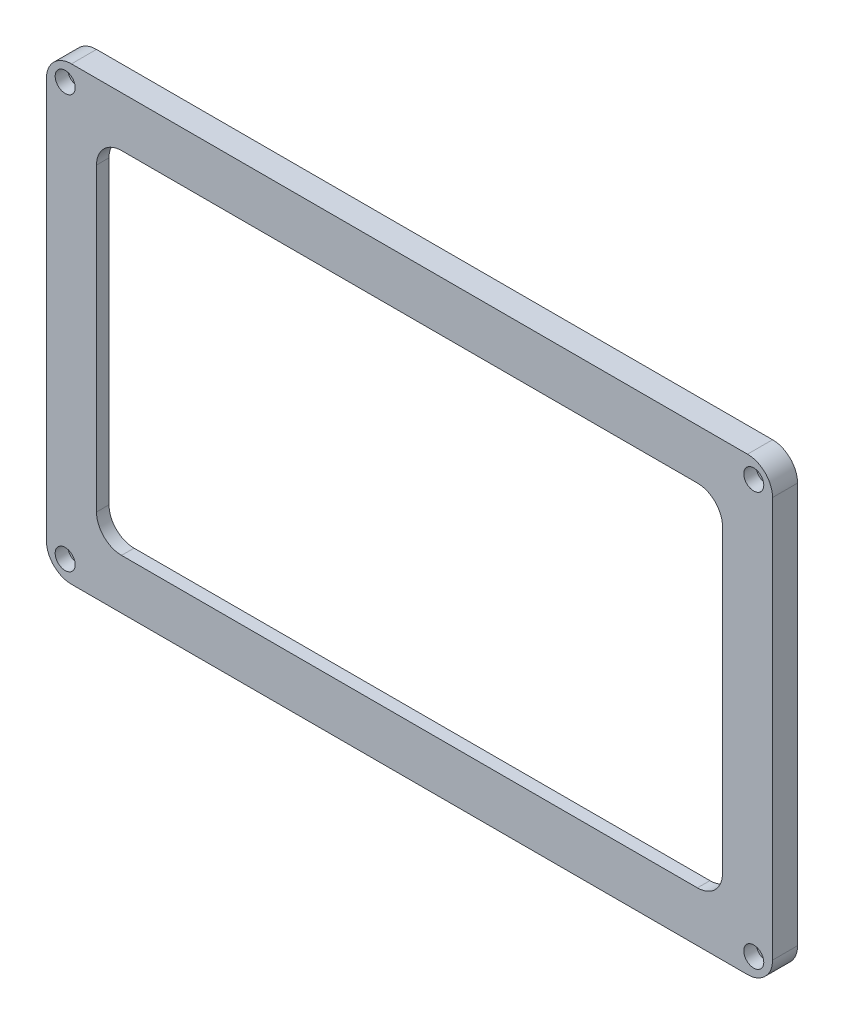
ISO-10303-21;
HEADER;
FILE_DESCRIPTION(('STEP AP214'),'2;1');
FILE_NAME('part.step','',(''),(''),'','','');
FILE_SCHEMA(('AUTOMOTIVE_DESIGN { 1 0 10303 214 1 1 1 1 }'));
ENDSEC;
DATA;
#1=APPLICATION_CONTEXT('core data for automotive mechanical design processes');
#2=APPLICATION_PROTOCOL_DEFINITION('international standard','automotive_design',2000,#1);
#3=PRODUCT_CONTEXT('',#1,'mechanical');
#4=PRODUCT('Part','Part','',(#3));
#5=PRODUCT_RELATED_PRODUCT_CATEGORY('part','',(#4));
#6=PRODUCT_DEFINITION_FORMATION('','',#4);
#7=PRODUCT_DEFINITION_CONTEXT('part definition',#1,'design');
#8=PRODUCT_DEFINITION('design','',#6,#7);
#9=PRODUCT_DEFINITION_SHAPE('','',#8);
#10=(LENGTH_UNIT() NAMED_UNIT(*) SI_UNIT(.MILLI.,.METRE.));
#11=(NAMED_UNIT(*) PLANE_ANGLE_UNIT() SI_UNIT($,.RADIAN.));
#12=(NAMED_UNIT(*) SI_UNIT($,.STERADIAN.) SOLID_ANGLE_UNIT());
#13=UNCERTAINTY_MEASURE_WITH_UNIT(LENGTH_MEASURE(1.E-05),#10,'distance_accuracy_value','');
#14=(GEOMETRIC_REPRESENTATION_CONTEXT(3) GLOBAL_UNCERTAINTY_ASSIGNED_CONTEXT((#13)) GLOBAL_UNIT_ASSIGNED_CONTEXT((#10,
#11,#12)) REPRESENTATION_CONTEXT('',''));
#15=CARTESIAN_POINT('',(0.,0.,0.));
#16=DIRECTION('',(0.,0.,1.));
#17=DIRECTION('',(1.,0.,0.));
#18=AXIS2_PLACEMENT_3D('',#15,#16,#17);
#19=CARTESIAN_POINT('',(29.,-18.,3.));
#20=DIRECTION('',(-1.,0.,0.));
#21=DIRECTION('',(0.,0.,1.));
#22=AXIS2_PLACEMENT_3D('',#19,#20,#21);
#23=PLANE('',#22);
#24=DIRECTION('',(0.,0.,-1.));
#25=VECTOR('',#24,1.);
#26=CARTESIAN_POINT('',(29.,-16.,3.));
#27=LINE('',#26,#25);
#28=CARTESIAN_POINT('',(29.,-16.,3.));
#29=VERTEX_POINT('',#28);
#30=CARTESIAN_POINT('',(29.,-16.,1.));
#31=VERTEX_POINT('',#30);
#32=EDGE_CURVE('E244',#29,#31,#27,.T.);
#33=ORIENTED_EDGE('',*,*,#32,.T.);
#34=DIRECTION('',(0.,-1.,0.));
#35=VECTOR('',#34,1.);
#36=CARTESIAN_POINT('',(29.,-18.,1.));
#37=LINE('',#36,#35);
#38=CARTESIAN_POINT('',(29.,16.,1.));
#39=VERTEX_POINT('',#38);
#40=EDGE_CURVE('E350',#39,#31,#37,.T.);
#41=ORIENTED_EDGE('',*,*,#40,.F.);
#42=DIRECTION('',(0.,0.,-1.));
#43=VECTOR('',#42,1.);
#44=CARTESIAN_POINT('',(29.,16.,3.));
#45=LINE('',#44,#43);
#46=CARTESIAN_POINT('',(29.,16.,3.));
#47=VERTEX_POINT('',#46);
#48=EDGE_CURVE('E247',#39,#47,#45,.F.);
#49=ORIENTED_EDGE('',*,*,#48,.T.);
#50=DIRECTION('',(0.,1.,0.));
#51=VECTOR('',#50,1.);
#52=CARTESIAN_POINT('',(29.,-18.,3.));
#53=LINE('',#52,#51);
#54=EDGE_CURVE('E394',#29,#47,#53,.T.);
#55=ORIENTED_EDGE('',*,*,#54,.F.);
#56=EDGE_LOOP('',(#33,#41,#49,#55));
#57=FACE_BOUND('',#56,.T.);
#58=ADVANCED_FACE('F35',(#57),#23,.F.);
#59=CARTESIAN_POINT('',(-29.,18.,3.));
#60=DIRECTION('',(0.,-1.,0.));
#61=DIRECTION('',(0.,0.,-1.));
#62=AXIS2_PLACEMENT_3D('',#59,#60,#61);
#63=PLANE('',#62);
#64=DIRECTION('',(0.,0.,-1.));
#65=VECTOR('',#64,1.);
#66=CARTESIAN_POINT('',(27.,18.,3.));
#67=LINE('',#66,#65);
#68=CARTESIAN_POINT('',(27.,18.,3.));
#69=VERTEX_POINT('',#68);
#70=CARTESIAN_POINT('',(27.,18.,1.));
#71=VERTEX_POINT('',#70);
#72=EDGE_CURVE('E226',#69,#71,#67,.T.);
#73=ORIENTED_EDGE('',*,*,#72,.T.);
#74=DIRECTION('',(1.,0.,0.));
#75=VECTOR('',#74,1.);
#76=CARTESIAN_POINT('',(29.,18.,1.));
#77=LINE('',#76,#75);
#78=CARTESIAN_POINT('',(-27.,18.,1.));
#79=VERTEX_POINT('',#78);
#80=EDGE_CURVE('E218',#79,#71,#77,.T.);
#81=ORIENTED_EDGE('',*,*,#80,.F.);
#82=DIRECTION('',(0.,0.,-1.));
#83=VECTOR('',#82,1.);
#84=CARTESIAN_POINT('',(-27.,18.,3.));
#85=LINE('',#84,#83);
#86=CARTESIAN_POINT('',(-27.,18.,3.));
#87=VERTEX_POINT('',#86);
#88=EDGE_CURVE('E235',#79,#87,#85,.F.);
#89=ORIENTED_EDGE('',*,*,#88,.T.);
#90=DIRECTION('',(-1.,0.,0.));
#91=VECTOR('',#90,1.);
#92=CARTESIAN_POINT('',(-29.,18.,3.));
#93=LINE('',#92,#91);
#94=EDGE_CURVE('E397',#69,#87,#93,.T.);
#95=ORIENTED_EDGE('',*,*,#94,.F.);
#96=EDGE_LOOP('',(#73,#81,#89,#95));
#97=FACE_BOUND('',#96,.T.);
#98=ADVANCED_FACE('F463',(#97),#63,.F.);
#99=CARTESIAN_POINT('',(-29.,-18.,3.));
#100=DIRECTION('',(1.,0.,0.));
#101=DIRECTION('',(0.,0.,-1.));
#102=AXIS2_PLACEMENT_3D('',#99,#100,#101);
#103=PLANE('',#102);
#104=DIRECTION('',(0.,0.,-1.));
#105=VECTOR('',#104,1.);
#106=CARTESIAN_POINT('',(-29.,16.,3.));
#107=LINE('',#106,#105);
#108=CARTESIAN_POINT('',(-29.,16.,3.));
#109=VERTEX_POINT('',#108);
#110=CARTESIAN_POINT('',(-29.,16.,1.));
#111=VERTEX_POINT('',#110);
#112=EDGE_CURVE('E217',#109,#111,#107,.T.);
#113=ORIENTED_EDGE('',*,*,#112,.T.);
#114=DIRECTION('',(0.,1.,0.));
#115=VECTOR('',#114,1.);
#116=CARTESIAN_POINT('',(-29.,-18.,1.));
#117=LINE('',#116,#115);
#118=CARTESIAN_POINT('',(-29.,-16.,1.));
#119=VERTEX_POINT('',#118);
#120=EDGE_CURVE('E199',#119,#111,#117,.T.);
#121=ORIENTED_EDGE('',*,*,#120,.F.);
#122=DIRECTION('',(0.,0.,-1.));
#123=VECTOR('',#122,1.);
#124=CARTESIAN_POINT('',(-29.,-16.,3.));
#125=LINE('',#124,#123);
#126=CARTESIAN_POINT('',(-29.,-16.,3.));
#127=VERTEX_POINT('',#126);
#128=EDGE_CURVE('E214',#119,#127,#125,.F.);
#129=ORIENTED_EDGE('',*,*,#128,.T.);
#130=DIRECTION('',(0.,-1.,0.));
#131=VECTOR('',#130,1.);
#132=CARTESIAN_POINT('',(-29.,-18.,3.));
#133=LINE('',#132,#131);
#134=EDGE_CURVE('E400',#109,#127,#133,.T.);
#135=ORIENTED_EDGE('',*,*,#134,.F.);
#136=EDGE_LOOP('',(#113,#121,#129,#135));
#137=FACE_BOUND('',#136,.T.);
#138=ADVANCED_FACE('F212',(#137),#103,.F.);
#139=CARTESIAN_POINT('',(-29.,-18.,3.));
#140=DIRECTION('',(0.,1.,0.));
#141=DIRECTION('',(0.,0.,1.));
#142=AXIS2_PLACEMENT_3D('',#139,#140,#141);
#143=PLANE('',#142);
#144=DIRECTION('',(0.,0.,-1.));
#145=VECTOR('',#144,1.);
#146=CARTESIAN_POINT('',(-27.,-18.,3.));
#147=LINE('',#146,#145);
#148=CARTESIAN_POINT('',(-27.,-18.,3.));
#149=VERTEX_POINT('',#148);
#150=CARTESIAN_POINT('',(-27.,-18.,1.));
#151=VERTEX_POINT('',#150);
#152=EDGE_CURVE('E249',#149,#151,#147,.T.);
#153=ORIENTED_EDGE('',*,*,#152,.T.);
#154=DIRECTION('',(-1.,0.,0.));
#155=VECTOR('',#154,1.);
#156=CARTESIAN_POINT('',(29.,-18.,1.));
#157=LINE('',#156,#155);
#158=CARTESIAN_POINT('',(27.,-18.,1.));
#159=VERTEX_POINT('',#158);
#160=EDGE_CURVE('E202',#159,#151,#157,.T.);
#161=ORIENTED_EDGE('',*,*,#160,.F.);
#162=DIRECTION('',(0.,0.,-1.));
#163=VECTOR('',#162,1.);
#164=CARTESIAN_POINT('',(27.,-18.,3.));
#165=LINE('',#164,#163);
#166=CARTESIAN_POINT('',(27.,-18.,3.));
#167=VERTEX_POINT('',#166);
#168=EDGE_CURVE('E251',#159,#167,#165,.F.);
#169=ORIENTED_EDGE('',*,*,#168,.T.);
#170=DIRECTION('',(1.,0.,0.));
#171=VECTOR('',#170,1.);
#172=CARTESIAN_POINT('',(-29.,-18.,3.));
#173=LINE('',#172,#171);
#174=EDGE_CURVE('E402',#149,#167,#173,.T.);
#175=ORIENTED_EDGE('',*,*,#174,.F.);
#176=EDGE_LOOP('',(#153,#161,#169,#175));
#177=FACE_BOUND('',#176,.T.);
#178=ADVANCED_FACE('F619',(#177),#143,.F.);
#179=CARTESIAN_POINT('',(0.,0.,3.));
#180=DIRECTION('',(0.,0.,-1.));
#181=DIRECTION('',(-1.,0.,0.));
#182=AXIS2_PLACEMENT_3D('',#179,#180,#181);
#183=PLANE('',#182);
#184=CARTESIAN_POINT('',(-27.5,-16.5,3.));
#185=DIRECTION('',(0.,0.,1.));
#186=DIRECTION('',(1.,0.,0.));
#187=AXIS2_PLACEMENT_3D('',#184,#185,#186);
#188=CIRCLE('',#187,0.799999999999999);
#189=CARTESIAN_POINT('',(-26.7,-16.5,3.));
#190=VERTEX_POINT('',#189);
#191=EDGE_CURVE('E330',#190,#190,#188,.T.);
#192=ORIENTED_EDGE('',*,*,#191,.F.);
#193=EDGE_LOOP('',(#192));
#194=FACE_BOUND('',#193,.T.);
#195=CARTESIAN_POINT('',(27.5,-16.5,3.));
#196=DIRECTION('',(0.,0.,1.));
#197=DIRECTION('',(1.,0.,0.));
#198=AXIS2_PLACEMENT_3D('',#195,#196,#197);
#199=CIRCLE('',#198,0.799999999999999);
#200=CARTESIAN_POINT('',(28.3,-16.5,3.));
#201=VERTEX_POINT('',#200);
#202=EDGE_CURVE('E339',#201,#201,#199,.T.);
#203=ORIENTED_EDGE('',*,*,#202,.F.);
#204=EDGE_LOOP('',(#203));
#205=FACE_BOUND('',#204,.T.);
#206=CARTESIAN_POINT('',(27.5,16.5,3.));
#207=DIRECTION('',(0.,0.,1.));
#208=DIRECTION('',(1.,0.,0.));
#209=AXIS2_PLACEMENT_3D('',#206,#207,#208);
#210=CIRCLE('',#209,0.799999999999999);
#211=CARTESIAN_POINT('',(28.3,16.5,3.));
#212=VERTEX_POINT('',#211);
#213=EDGE_CURVE('E608',#212,#212,#210,.T.);
#214=ORIENTED_EDGE('',*,*,#213,.F.);
#215=EDGE_LOOP('',(#214));
#216=FACE_BOUND('',#215,.T.);
#217=CARTESIAN_POINT('',(-27.5,16.5,3.));
#218=DIRECTION('',(0.,0.,1.));
#219=DIRECTION('',(1.,0.,0.));
#220=AXIS2_PLACEMENT_3D('',#217,#218,#219);
#221=CIRCLE('',#220,0.799999999999999);
#222=CARTESIAN_POINT('',(-26.7,16.5,3.));
#223=VERTEX_POINT('',#222);
#224=EDGE_CURVE('E345',#223,#223,#221,.T.);
#225=ORIENTED_EDGE('',*,*,#224,.F.);
#226=EDGE_LOOP('',(#225));
#227=FACE_BOUND('',#226,.T.);
#228=DIRECTION('',(-1.,0.,0.));
#229=VECTOR('',#228,1.);
#230=CARTESIAN_POINT('',(-25.,14.,3.));
#231=LINE('',#230,#229);
#232=CARTESIAN_POINT('',(23.,14.,3.));
#233=VERTEX_POINT('',#232);
#234=CARTESIAN_POINT('',(-23.,14.,3.));
#235=VERTEX_POINT('',#234);
#236=EDGE_CURVE('E373',#233,#235,#231,.T.);
#237=ORIENTED_EDGE('',*,*,#236,.F.);
#238=CARTESIAN_POINT('',(23.,12.,3.));
#239=DIRECTION('',(0.,0.,-1.));
#240=DIRECTION('',(-1.,0.,0.));
#241=AXIS2_PLACEMENT_3D('',#238,#239,#240);
#242=CIRCLE('',#241,2.);
#243=CARTESIAN_POINT('',(25.,12.,3.));
#244=VERTEX_POINT('',#243);
#245=EDGE_CURVE('E281',#233,#244,#242,.T.);
#246=ORIENTED_EDGE('',*,*,#245,.T.);
#247=DIRECTION('',(0.,1.,0.));
#248=VECTOR('',#247,1.);
#249=CARTESIAN_POINT('',(25.,-14.,3.));
#250=LINE('',#249,#248);
#251=CARTESIAN_POINT('',(25.,-12.,3.));
#252=VERTEX_POINT('',#251);
#253=EDGE_CURVE('E370',#252,#244,#250,.T.);
#254=ORIENTED_EDGE('',*,*,#253,.F.);
#255=CARTESIAN_POINT('',(23.,-12.,3.));
#256=DIRECTION('',(0.,0.,-1.));
#257=DIRECTION('',(-1.,0.,0.));
#258=AXIS2_PLACEMENT_3D('',#255,#256,#257);
#259=CIRCLE('',#258,2.);
#260=CARTESIAN_POINT('',(23.,-14.,3.));
#261=VERTEX_POINT('',#260);
#262=EDGE_CURVE('E277',#252,#261,#259,.T.);
#263=ORIENTED_EDGE('',*,*,#262,.T.);
#264=DIRECTION('',(1.,0.,0.));
#265=VECTOR('',#264,1.);
#266=CARTESIAN_POINT('',(-25.,-14.,3.));
#267=LINE('',#266,#265);
#268=CARTESIAN_POINT('',(-23.,-14.,3.));
#269=VERTEX_POINT('',#268);
#270=EDGE_CURVE('E379',#269,#261,#267,.T.);
#271=ORIENTED_EDGE('',*,*,#270,.F.);
#272=CARTESIAN_POINT('',(-23.,-12.,3.));
#273=DIRECTION('',(0.,0.,-1.));
#274=DIRECTION('',(-1.,0.,0.));
#275=AXIS2_PLACEMENT_3D('',#272,#273,#274);
#276=CIRCLE('',#275,2.);
#277=CARTESIAN_POINT('',(-25.,-12.,3.));
#278=VERTEX_POINT('',#277);
#279=EDGE_CURVE('E273',#269,#278,#276,.T.);
#280=ORIENTED_EDGE('',*,*,#279,.T.);
#281=DIRECTION('',(0.,-1.,0.));
#282=VECTOR('',#281,1.);
#283=CARTESIAN_POINT('',(-25.,-14.,3.));
#284=LINE('',#283,#282);
#285=CARTESIAN_POINT('',(-25.,12.,3.));
#286=VERTEX_POINT('',#285);
#287=EDGE_CURVE('E376',#286,#278,#284,.T.);
#288=ORIENTED_EDGE('',*,*,#287,.F.);
#289=CARTESIAN_POINT('',(-23.,12.,3.));
#290=DIRECTION('',(0.,0.,-1.));
#291=DIRECTION('',(-1.,0.,0.));
#292=AXIS2_PLACEMENT_3D('',#289,#290,#291);
#293=CIRCLE('',#292,2.);
#294=EDGE_CURVE('E285',#286,#235,#293,.T.);
#295=ORIENTED_EDGE('',*,*,#294,.T.);
#296=EDGE_LOOP('',(#237,#246,#254,#263,#271,#280,#288,#295));
#297=FACE_BOUND('',#296,.T.);
#298=ORIENTED_EDGE('',*,*,#94,.T.);
#299=CARTESIAN_POINT('',(-27.,16.,3.));
#300=DIRECTION('',(0.,0.,-1.));
#301=DIRECTION('',(-1.,0.,0.));
#302=AXIS2_PLACEMENT_3D('',#299,#300,#301);
#303=CIRCLE('',#302,2.);
#304=EDGE_CURVE('E242',#87,#109,#303,.F.);
#305=ORIENTED_EDGE('',*,*,#304,.T.);
#306=ORIENTED_EDGE('',*,*,#134,.T.);
#307=CARTESIAN_POINT('',(-27.,-16.,3.));
#308=DIRECTION('',(0.,0.,-1.));
#309=DIRECTION('',(-1.,0.,0.));
#310=AXIS2_PLACEMENT_3D('',#307,#308,#309);
#311=CIRCLE('',#310,2.);
#312=EDGE_CURVE('E223',#127,#149,#311,.F.);
#313=ORIENTED_EDGE('',*,*,#312,.T.);
#314=ORIENTED_EDGE('',*,*,#174,.T.);
#315=CARTESIAN_POINT('',(27.,-16.,3.));
#316=DIRECTION('',(0.,0.,-1.));
#317=DIRECTION('',(-1.,0.,0.));
#318=AXIS2_PLACEMENT_3D('',#315,#316,#317);
#319=CIRCLE('',#318,2.);
#320=EDGE_CURVE('E238',#167,#29,#319,.F.);
#321=ORIENTED_EDGE('',*,*,#320,.T.);
#322=ORIENTED_EDGE('',*,*,#54,.T.);
#323=CARTESIAN_POINT('',(27.,16.,3.));
#324=DIRECTION('',(0.,0.,-1.));
#325=DIRECTION('',(-1.,0.,0.));
#326=AXIS2_PLACEMENT_3D('',#323,#324,#325);
#327=CIRCLE('',#326,2.);
#328=EDGE_CURVE('E240',#47,#69,#327,.F.);
#329=ORIENTED_EDGE('',*,*,#328,.T.);
#330=EDGE_LOOP('',(#298,#305,#306,#313,#314,#321,#322,#329));
#331=FACE_BOUND('',#330,.T.);
#332=ADVANCED_FACE('F430',(#194,#205,#216,#227,#297,#331),#183,.F.);
#333=CARTESIAN_POINT('',(-26.25,-15.25,2.));
#334=DIRECTION('',(-1.,0.,0.));
#335=DIRECTION('',(0.,0.,1.));
#336=AXIS2_PLACEMENT_3D('',#333,#334,#335);
#337=PLANE('',#336);
#338=DIRECTION('',(0.,1.,0.));
#339=VECTOR('',#338,1.);
#340=CARTESIAN_POINT('',(-26.25,-15.25,1.));
#341=LINE('',#340,#339);
#342=CARTESIAN_POINT('',(-26.25,-15.05,1.));
#343=VERTEX_POINT('',#342);
#344=CARTESIAN_POINT('',(-26.25,15.05,1.));
#345=VERTEX_POINT('',#344);
#346=EDGE_CURVE('E367',#343,#345,#341,.T.);
#347=ORIENTED_EDGE('',*,*,#346,.T.);
#348=DIRECTION('',(0.,0.,-1.));
#349=VECTOR('',#348,1.);
#350=CARTESIAN_POINT('',(-26.25,15.05,2.));
#351=LINE('',#350,#349);
#352=CARTESIAN_POINT('',(-26.25,15.05,2.));
#353=VERTEX_POINT('',#352);
#354=EDGE_CURVE('E308',#345,#353,#351,.F.);
#355=ORIENTED_EDGE('',*,*,#354,.T.);
#356=DIRECTION('',(0.,1.,0.));
#357=VECTOR('',#356,1.);
#358=CARTESIAN_POINT('',(-26.25,-15.25,2.));
#359=LINE('',#358,#357);
#360=CARTESIAN_POINT('',(-26.25,-15.05,2.));
#361=VERTEX_POINT('',#360);
#362=EDGE_CURVE('E382',#361,#353,#359,.T.);
#363=ORIENTED_EDGE('',*,*,#362,.F.);
#364=DIRECTION('',(0.,0.,-1.));
#365=VECTOR('',#364,1.);
#366=CARTESIAN_POINT('',(-26.25,-15.05,1.));
#367=LINE('',#366,#365);
#368=EDGE_CURVE('E305',#361,#343,#367,.T.);
#369=ORIENTED_EDGE('',*,*,#368,.T.);
#370=EDGE_LOOP('',(#347,#355,#363,#369));
#371=FACE_BOUND('',#370,.T.);
#372=ADVANCED_FACE('F516',(#371),#337,.F.);
#373=CARTESIAN_POINT('',(26.25,-15.25,2.));
#374=DIRECTION('',(0.,-1.,0.));
#375=DIRECTION('',(0.,0.,-1.));
#376=AXIS2_PLACEMENT_3D('',#373,#374,#375);
#377=PLANE('',#376);
#378=DIRECTION('',(-1.,0.,0.));
#379=VECTOR('',#378,1.);
#380=CARTESIAN_POINT('',(26.25,-15.25,1.));
#381=LINE('',#380,#379);
#382=CARTESIAN_POINT('',(26.05,-15.25,1.));
#383=VERTEX_POINT('',#382);
#384=CARTESIAN_POINT('',(-26.05,-15.25,1.));
#385=VERTEX_POINT('',#384);
#386=EDGE_CURVE('E365',#383,#385,#381,.T.);
#387=ORIENTED_EDGE('',*,*,#386,.T.);
#388=DIRECTION('',(0.,0.,-1.));
#389=VECTOR('',#388,1.);
#390=CARTESIAN_POINT('',(-26.05,-15.25,2.));
#391=LINE('',#390,#389);
#392=CARTESIAN_POINT('',(-26.05,-15.25,2.));
#393=VERTEX_POINT('',#392);
#394=EDGE_CURVE('E312',#385,#393,#391,.F.);
#395=ORIENTED_EDGE('',*,*,#394,.T.);
#396=DIRECTION('',(-1.,0.,0.));
#397=VECTOR('',#396,1.);
#398=CARTESIAN_POINT('',(26.25,-15.25,2.));
#399=LINE('',#398,#397);
#400=CARTESIAN_POINT('',(26.05,-15.25,2.));
#401=VERTEX_POINT('',#400);
#402=EDGE_CURVE('E391',#401,#393,#399,.T.);
#403=ORIENTED_EDGE('',*,*,#402,.F.);
#404=DIRECTION('',(0.,0.,-1.));
#405=VECTOR('',#404,1.);
#406=CARTESIAN_POINT('',(26.05,-15.25,1.));
#407=LINE('',#406,#405);
#408=EDGE_CURVE('E310',#401,#383,#407,.T.);
#409=ORIENTED_EDGE('',*,*,#408,.T.);
#410=EDGE_LOOP('',(#387,#395,#403,#409));
#411=FACE_BOUND('',#410,.T.);
#412=ADVANCED_FACE('F532',(#411),#377,.F.);
#413=CARTESIAN_POINT('',(26.25,-15.25,2.));
#414=DIRECTION('',(1.,0.,0.));
#415=DIRECTION('',(0.,0.,-1.));
#416=AXIS2_PLACEMENT_3D('',#413,#414,#415);
#417=PLANE('',#416);
#418=DIRECTION('',(0.,-1.,0.));
#419=VECTOR('',#418,1.);
#420=CARTESIAN_POINT('',(26.25,-15.25,2.));
#421=LINE('',#420,#419);
#422=CARTESIAN_POINT('',(26.25,15.05,2.));
#423=VERTEX_POINT('',#422);
#424=CARTESIAN_POINT('',(26.25,-15.05,2.));
#425=VERTEX_POINT('',#424);
#426=EDGE_CURVE('E388',#423,#425,#421,.T.);
#427=ORIENTED_EDGE('',*,*,#426,.F.);
#428=DIRECTION('',(0.,0.,-1.));
#429=VECTOR('',#428,1.);
#430=CARTESIAN_POINT('',(26.25,15.05,1.));
#431=LINE('',#430,#429);
#432=CARTESIAN_POINT('',(26.25,15.05,1.));
#433=VERTEX_POINT('',#432);
#434=EDGE_CURVE('E289',#423,#433,#431,.T.);
#435=ORIENTED_EDGE('',*,*,#434,.T.);
#436=DIRECTION('',(0.,-1.,0.));
#437=VECTOR('',#436,1.);
#438=CARTESIAN_POINT('',(26.25,-15.25,1.));
#439=LINE('',#438,#437);
#440=CARTESIAN_POINT('',(26.25,-15.05,1.));
#441=VERTEX_POINT('',#440);
#442=EDGE_CURVE('E362',#433,#441,#439,.T.);
#443=ORIENTED_EDGE('',*,*,#442,.T.);
#444=DIRECTION('',(0.,0.,-1.));
#445=VECTOR('',#444,1.);
#446=CARTESIAN_POINT('',(26.25,-15.05,2.));
#447=LINE('',#446,#445);
#448=EDGE_CURVE('E207',#441,#425,#447,.F.);
#449=ORIENTED_EDGE('',*,*,#448,.T.);
#450=EDGE_LOOP('',(#427,#435,#443,#449));
#451=FACE_BOUND('',#450,.T.);
#452=ADVANCED_FACE('F529',(#451),#417,.F.);
#453=CARTESIAN_POINT('',(26.25,15.25,2.));
#454=DIRECTION('',(0.,1.,0.));
#455=DIRECTION('',(0.,0.,1.));
#456=AXIS2_PLACEMENT_3D('',#453,#454,#455);
#457=PLANE('',#456);
#458=DIRECTION('',(1.,0.,0.));
#459=VECTOR('',#458,1.);
#460=CARTESIAN_POINT('',(26.25,15.25,1.));
#461=LINE('',#460,#459);
#462=CARTESIAN_POINT('',(-26.05,15.25,1.));
#463=VERTEX_POINT('',#462);
#464=CARTESIAN_POINT('',(26.05,15.25,1.));
#465=VERTEX_POINT('',#464);
#466=EDGE_CURVE('E359',#463,#465,#461,.T.);
#467=ORIENTED_EDGE('',*,*,#466,.T.);
#468=DIRECTION('',(0.,0.,-1.));
#469=VECTOR('',#468,1.);
#470=CARTESIAN_POINT('',(26.05,15.25,2.));
#471=LINE('',#470,#469);
#472=CARTESIAN_POINT('',(26.05,15.25,2.));
#473=VERTEX_POINT('',#472);
#474=EDGE_CURVE('E295',#465,#473,#471,.F.);
#475=ORIENTED_EDGE('',*,*,#474,.T.);
#476=DIRECTION('',(1.,0.,0.));
#477=VECTOR('',#476,1.);
#478=CARTESIAN_POINT('',(26.25,15.25,2.));
#479=LINE('',#478,#477);
#480=CARTESIAN_POINT('',(-26.05,15.25,2.));
#481=VERTEX_POINT('',#480);
#482=EDGE_CURVE('E385',#481,#473,#479,.T.);
#483=ORIENTED_EDGE('',*,*,#482,.F.);
#484=DIRECTION('',(0.,0.,-1.));
#485=VECTOR('',#484,1.);
#486=CARTESIAN_POINT('',(-26.05,15.25,1.));
#487=LINE('',#486,#485);
#488=EDGE_CURVE('E292',#481,#463,#487,.T.);
#489=ORIENTED_EDGE('',*,*,#488,.T.);
#490=EDGE_LOOP('',(#467,#475,#483,#489));
#491=FACE_BOUND('',#490,.T.);
#492=ADVANCED_FACE('F522',(#491),#457,.F.);
#493=CARTESIAN_POINT('',(0.,0.,2.));
#494=DIRECTION('',(0.,0.,1.));
#495=DIRECTION('',(1.,0.,0.));
#496=AXIS2_PLACEMENT_3D('',#493,#494,#495);
#497=PLANE('',#496);
#498=DIRECTION('',(0.,-1.,0.));
#499=VECTOR('',#498,1.);
#500=CARTESIAN_POINT('',(-25.,0.,2.));
#501=LINE('',#500,#499);
#502=CARTESIAN_POINT('',(-25.,12.,2.));
#503=VERTEX_POINT('',#502);
#504=CARTESIAN_POINT('',(-25.,-12.,2.));
#505=VERTEX_POINT('',#504);
#506=EDGE_CURVE('E408',#503,#505,#501,.T.);
#507=ORIENTED_EDGE('',*,*,#506,.T.);
#508=CARTESIAN_POINT('',(-23.,-12.,2.));
#509=DIRECTION('',(0.,0.,1.));
#510=DIRECTION('',(1.,0.,0.));
#511=AXIS2_PLACEMENT_3D('',#508,#509,#510);
#512=CIRCLE('',#511,2.);
#513=CARTESIAN_POINT('',(-23.,-14.,2.));
#514=VERTEX_POINT('',#513);
#515=EDGE_CURVE('E275',#505,#514,#512,.T.);
#516=ORIENTED_EDGE('',*,*,#515,.T.);
#517=DIRECTION('',(1.,0.,0.));
#518=VECTOR('',#517,1.);
#519=CARTESIAN_POINT('',(0.,-14.,2.));
#520=LINE('',#519,#518);
#521=CARTESIAN_POINT('',(23.,-14.,2.));
#522=VERTEX_POINT('',#521);
#523=EDGE_CURVE('E229',#514,#522,#520,.T.);
#524=ORIENTED_EDGE('',*,*,#523,.T.);
#525=CARTESIAN_POINT('',(23.,-12.,2.));
#526=DIRECTION('',(0.,0.,1.));
#527=DIRECTION('',(1.,0.,0.));
#528=AXIS2_PLACEMENT_3D('',#525,#526,#527);
#529=CIRCLE('',#528,2.);
#530=CARTESIAN_POINT('',(25.,-12.,2.));
#531=VERTEX_POINT('',#530);
#532=EDGE_CURVE('E279',#522,#531,#529,.T.);
#533=ORIENTED_EDGE('',*,*,#532,.T.);
#534=DIRECTION('',(0.,1.,0.));
#535=VECTOR('',#534,1.);
#536=CARTESIAN_POINT('',(25.,0.,2.));
#537=LINE('',#536,#535);
#538=CARTESIAN_POINT('',(25.,12.,2.));
#539=VERTEX_POINT('',#538);
#540=EDGE_CURVE('E224',#531,#539,#537,.T.);
#541=ORIENTED_EDGE('',*,*,#540,.T.);
#542=CARTESIAN_POINT('',(23.,12.,2.));
#543=DIRECTION('',(0.,0.,1.));
#544=DIRECTION('',(1.,0.,0.));
#545=AXIS2_PLACEMENT_3D('',#542,#543,#544);
#546=CIRCLE('',#545,2.);
#547=CARTESIAN_POINT('',(23.,14.,2.));
#548=VERTEX_POINT('',#547);
#549=EDGE_CURVE('E283',#539,#548,#546,.T.);
#550=ORIENTED_EDGE('',*,*,#549,.T.);
#551=DIRECTION('',(-1.,0.,0.));
#552=VECTOR('',#551,1.);
#553=CARTESIAN_POINT('',(0.,14.,2.));
#554=LINE('',#553,#552);
#555=CARTESIAN_POINT('',(-23.,14.,2.));
#556=VERTEX_POINT('',#555);
#557=EDGE_CURVE('E405',#548,#556,#554,.T.);
#558=ORIENTED_EDGE('',*,*,#557,.T.);
#559=CARTESIAN_POINT('',(-23.,12.,2.));
#560=DIRECTION('',(0.,0.,1.));
#561=DIRECTION('',(1.,0.,0.));
#562=AXIS2_PLACEMENT_3D('',#559,#560,#561);
#563=CIRCLE('',#562,2.);
#564=EDGE_CURVE('E208',#556,#503,#563,.T.);
#565=ORIENTED_EDGE('',*,*,#564,.T.);
#566=EDGE_LOOP('',(#507,#516,#524,#533,#541,#550,#558,#565));
#567=FACE_BOUND('',#566,.T.);
#568=ORIENTED_EDGE('',*,*,#482,.T.);
#569=CARTESIAN_POINT('',(26.05,15.05,2.));
#570=DIRECTION('',(0.,0.,1.));
#571=DIRECTION('',(1.,0.,0.));
#572=AXIS2_PLACEMENT_3D('',#569,#570,#571);
#573=CIRCLE('',#572,0.2);
#574=EDGE_CURVE('E303',#473,#423,#573,.F.);
#575=ORIENTED_EDGE('',*,*,#574,.T.);
#576=ORIENTED_EDGE('',*,*,#426,.T.);
#577=CARTESIAN_POINT('',(26.05,-15.05,2.));
#578=DIRECTION('',(0.,0.,1.));
#579=DIRECTION('',(1.,0.,0.));
#580=AXIS2_PLACEMENT_3D('',#577,#578,#579);
#581=CIRCLE('',#580,0.2);
#582=EDGE_CURVE('E297',#425,#401,#581,.F.);
#583=ORIENTED_EDGE('',*,*,#582,.T.);
#584=ORIENTED_EDGE('',*,*,#402,.T.);
#585=CARTESIAN_POINT('',(-26.05,-15.05,2.));
#586=DIRECTION('',(0.,0.,1.));
#587=DIRECTION('',(1.,0.,0.));
#588=AXIS2_PLACEMENT_3D('',#585,#586,#587);
#589=CIRCLE('',#588,0.2);
#590=EDGE_CURVE('E299',#393,#361,#589,.F.);
#591=ORIENTED_EDGE('',*,*,#590,.T.);
#592=ORIENTED_EDGE('',*,*,#362,.T.);
#593=CARTESIAN_POINT('',(-26.05,15.05,2.));
#594=DIRECTION('',(0.,0.,1.));
#595=DIRECTION('',(1.,0.,0.));
#596=AXIS2_PLACEMENT_3D('',#593,#594,#595);
#597=CIRCLE('',#596,0.2);
#598=EDGE_CURVE('E301',#353,#481,#597,.F.);
#599=ORIENTED_EDGE('',*,*,#598,.T.);
#600=EDGE_LOOP('',(#568,#575,#576,#583,#584,#591,#592,#599));
#601=FACE_BOUND('',#600,.T.);
#602=ADVANCED_FACE('F414',(#567,#601),#497,.F.);
#603=CARTESIAN_POINT('',(25.,-14.,1.));
#604=DIRECTION('',(1.,0.,0.));
#605=DIRECTION('',(0.,0.,-1.));
#606=AXIS2_PLACEMENT_3D('',#603,#604,#605);
#607=PLANE('',#606);
#608=ORIENTED_EDGE('',*,*,#540,.F.);
#609=DIRECTION('',(0.,0.,1.));
#610=VECTOR('',#609,1.);
#611=CARTESIAN_POINT('',(25.,-12.,3.));
#612=LINE('',#611,#610);
#613=EDGE_CURVE('E265',#531,#252,#612,.T.);
#614=ORIENTED_EDGE('',*,*,#613,.T.);
#615=ORIENTED_EDGE('',*,*,#253,.T.);
#616=DIRECTION('',(0.,0.,1.));
#617=VECTOR('',#616,1.);
#618=CARTESIAN_POINT('',(25.,12.,2.));
#619=LINE('',#618,#617);
#620=EDGE_CURVE('E263',#244,#539,#619,.F.);
#621=ORIENTED_EDGE('',*,*,#620,.T.);
#622=EDGE_LOOP('',(#608,#614,#615,#621));
#623=FACE_BOUND('',#622,.T.);
#624=ADVANCED_FACE('F426',(#623),#607,.F.);
#625=CARTESIAN_POINT('',(-25.,-14.,1.));
#626=DIRECTION('',(0.,-1.,0.));
#627=DIRECTION('',(0.,0.,-1.));
#628=AXIS2_PLACEMENT_3D('',#625,#626,#627);
#629=PLANE('',#628);
#630=ORIENTED_EDGE('',*,*,#523,.F.);
#631=DIRECTION('',(0.,0.,1.));
#632=VECTOR('',#631,1.);
#633=CARTESIAN_POINT('',(-23.,-14.,3.));
#634=LINE('',#633,#632);
#635=EDGE_CURVE('E255',#514,#269,#634,.T.);
#636=ORIENTED_EDGE('',*,*,#635,.T.);
#637=ORIENTED_EDGE('',*,*,#270,.T.);
#638=DIRECTION('',(0.,0.,1.));
#639=VECTOR('',#638,1.);
#640=CARTESIAN_POINT('',(23.,-14.,2.));
#641=LINE('',#640,#639);
#642=EDGE_CURVE('E253',#261,#522,#641,.F.);
#643=ORIENTED_EDGE('',*,*,#642,.T.);
#644=EDGE_LOOP('',(#630,#636,#637,#643));
#645=FACE_BOUND('',#644,.T.);
#646=ADVANCED_FACE('F452',(#645),#629,.F.);
#647=CARTESIAN_POINT('',(-25.,-14.,1.));
#648=DIRECTION('',(-1.,0.,0.));
#649=DIRECTION('',(0.,0.,1.));
#650=AXIS2_PLACEMENT_3D('',#647,#648,#649);
#651=PLANE('',#650);
#652=ORIENTED_EDGE('',*,*,#287,.T.);
#653=DIRECTION('',(0.,0.,1.));
#654=VECTOR('',#653,1.);
#655=CARTESIAN_POINT('',(-25.,-12.,2.));
#656=LINE('',#655,#654);
#657=EDGE_CURVE('E261',#278,#505,#656,.F.);
#658=ORIENTED_EDGE('',*,*,#657,.T.);
#659=ORIENTED_EDGE('',*,*,#506,.F.);
#660=DIRECTION('',(0.,0.,1.));
#661=VECTOR('',#660,1.);
#662=CARTESIAN_POINT('',(-25.,12.,3.));
#663=LINE('',#662,#661);
#664=EDGE_CURVE('E258',#503,#286,#663,.T.);
#665=ORIENTED_EDGE('',*,*,#664,.T.);
#666=EDGE_LOOP('',(#652,#658,#659,#665));
#667=FACE_BOUND('',#666,.T.);
#668=ADVANCED_FACE('F448',(#667),#651,.F.);
#669=CARTESIAN_POINT('',(-25.,14.,1.));
#670=DIRECTION('',(0.,1.,0.));
#671=DIRECTION('',(0.,0.,1.));
#672=AXIS2_PLACEMENT_3D('',#669,#670,#671);
#673=PLANE('',#672);
#674=ORIENTED_EDGE('',*,*,#557,.F.);
#675=DIRECTION('',(0.,0.,1.));
#676=VECTOR('',#675,1.);
#677=CARTESIAN_POINT('',(23.,14.,3.));
#678=LINE('',#677,#676);
#679=EDGE_CURVE('E270',#548,#233,#678,.T.);
#680=ORIENTED_EDGE('',*,*,#679,.T.);
#681=ORIENTED_EDGE('',*,*,#236,.T.);
#682=DIRECTION('',(0.,0.,1.));
#683=VECTOR('',#682,1.);
#684=CARTESIAN_POINT('',(-23.,14.,2.));
#685=LINE('',#684,#683);
#686=EDGE_CURVE('E268',#235,#556,#685,.F.);
#687=ORIENTED_EDGE('',*,*,#686,.T.);
#688=EDGE_LOOP('',(#674,#680,#681,#687));
#689=FACE_BOUND('',#688,.T.);
#690=ADVANCED_FACE('F439',(#689),#673,.F.);
#691=CARTESIAN_POINT('',(-27.,16.,3.));
#692=DIRECTION('',(0.,0.,-1.));
#693=DIRECTION('',(-1.,0.,0.));
#694=AXIS2_PLACEMENT_3D('',#691,#692,#693);
#695=CYLINDRICAL_SURFACE('',#694,2.);
#696=CARTESIAN_POINT('',(-27.,16.,1.));
#697=DIRECTION('',(0.,0.,1.));
#698=DIRECTION('',(1.,0.,0.));
#699=AXIS2_PLACEMENT_3D('',#696,#697,#698);
#700=CIRCLE('',#699,2.);
#701=EDGE_CURVE('E357',#111,#79,#700,.F.);
#702=ORIENTED_EDGE('',*,*,#701,.F.);
#703=ORIENTED_EDGE('',*,*,#112,.F.);
#704=ORIENTED_EDGE('',*,*,#304,.F.);
#705=ORIENTED_EDGE('',*,*,#88,.F.);
#706=EDGE_LOOP('',(#702,#703,#704,#705));
#707=FACE_BOUND('',#706,.T.);
#708=ADVANCED_FACE('F473',(#707),#695,.T.);
#709=CARTESIAN_POINT('',(27.,16.,3.));
#710=DIRECTION('',(0.,0.,-1.));
#711=DIRECTION('',(-1.,0.,0.));
#712=AXIS2_PLACEMENT_3D('',#709,#710,#711);
#713=CYLINDRICAL_SURFACE('',#712,2.);
#714=CARTESIAN_POINT('',(27.,16.,1.));
#715=DIRECTION('',(0.,0.,1.));
#716=DIRECTION('',(1.,0.,0.));
#717=AXIS2_PLACEMENT_3D('',#714,#715,#716);
#718=CIRCLE('',#717,2.);
#719=EDGE_CURVE('E355',#71,#39,#718,.F.);
#720=ORIENTED_EDGE('',*,*,#719,.F.);
#721=ORIENTED_EDGE('',*,*,#72,.F.);
#722=ORIENTED_EDGE('',*,*,#328,.F.);
#723=ORIENTED_EDGE('',*,*,#48,.F.);
#724=EDGE_LOOP('',(#720,#721,#722,#723));
#725=FACE_BOUND('',#724,.T.);
#726=ADVANCED_FACE('F476',(#725),#713,.T.);
#727=CARTESIAN_POINT('',(27.,-16.,3.));
#728=DIRECTION('',(0.,0.,-1.));
#729=DIRECTION('',(-1.,0.,0.));
#730=AXIS2_PLACEMENT_3D('',#727,#728,#729);
#731=CYLINDRICAL_SURFACE('',#730,2.);
#732=CARTESIAN_POINT('',(27.,-16.,1.));
#733=DIRECTION('',(0.,0.,1.));
#734=DIRECTION('',(1.,0.,0.));
#735=AXIS2_PLACEMENT_3D('',#732,#733,#734);
#736=CIRCLE('',#735,2.);
#737=EDGE_CURVE('E353',#31,#159,#736,.F.);
#738=ORIENTED_EDGE('',*,*,#737,.F.);
#739=ORIENTED_EDGE('',*,*,#32,.F.);
#740=ORIENTED_EDGE('',*,*,#320,.F.);
#741=ORIENTED_EDGE('',*,*,#168,.F.);
#742=EDGE_LOOP('',(#738,#739,#740,#741));
#743=FACE_BOUND('',#742,.T.);
#744=ADVANCED_FACE('F480',(#743),#731,.T.);
#745=CARTESIAN_POINT('',(-27.,-16.,3.));
#746=DIRECTION('',(0.,0.,-1.));
#747=DIRECTION('',(-1.,0.,0.));
#748=AXIS2_PLACEMENT_3D('',#745,#746,#747);
#749=CYLINDRICAL_SURFACE('',#748,2.);
#750=CARTESIAN_POINT('',(-27.,-16.,1.));
#751=DIRECTION('',(0.,0.,1.));
#752=DIRECTION('',(1.,0.,0.));
#753=AXIS2_PLACEMENT_3D('',#750,#751,#752);
#754=CIRCLE('',#753,2.);
#755=EDGE_CURVE('E196',#151,#119,#754,.F.);
#756=ORIENTED_EDGE('',*,*,#755,.F.);
#757=ORIENTED_EDGE('',*,*,#152,.F.);
#758=ORIENTED_EDGE('',*,*,#312,.F.);
#759=ORIENTED_EDGE('',*,*,#128,.F.);
#760=EDGE_LOOP('',(#756,#757,#758,#759));
#761=FACE_BOUND('',#760,.T.);
#762=ADVANCED_FACE('F222',(#761),#749,.T.);
#763=CARTESIAN_POINT('',(-23.,-12.,1.));
#764=DIRECTION('',(0.,0.,-1.));
#765=DIRECTION('',(-1.,0.,0.));
#766=AXIS2_PLACEMENT_3D('',#763,#764,#765);
#767=CYLINDRICAL_SURFACE('',#766,2.);
#768=ORIENTED_EDGE('',*,*,#515,.F.);
#769=ORIENTED_EDGE('',*,*,#657,.F.);
#770=ORIENTED_EDGE('',*,*,#279,.F.);
#771=ORIENTED_EDGE('',*,*,#635,.F.);
#772=EDGE_LOOP('',(#768,#769,#770,#771));
#773=FACE_BOUND('',#772,.T.);
#774=ADVANCED_FACE('F451',(#773),#767,.F.);
#775=CARTESIAN_POINT('',(23.,-12.,1.));
#776=DIRECTION('',(0.,0.,-1.));
#777=DIRECTION('',(-1.,0.,0.));
#778=AXIS2_PLACEMENT_3D('',#775,#776,#777);
#779=CYLINDRICAL_SURFACE('',#778,2.);
#780=ORIENTED_EDGE('',*,*,#532,.F.);
#781=ORIENTED_EDGE('',*,*,#642,.F.);
#782=ORIENTED_EDGE('',*,*,#262,.F.);
#783=ORIENTED_EDGE('',*,*,#613,.F.);
#784=EDGE_LOOP('',(#780,#781,#782,#783));
#785=FACE_BOUND('',#784,.T.);
#786=ADVANCED_FACE('F423',(#785),#779,.F.);
#787=CARTESIAN_POINT('',(23.,12.,1.));
#788=DIRECTION('',(0.,0.,-1.));
#789=DIRECTION('',(-1.,0.,0.));
#790=AXIS2_PLACEMENT_3D('',#787,#788,#789);
#791=CYLINDRICAL_SURFACE('',#790,2.);
#792=ORIENTED_EDGE('',*,*,#549,.F.);
#793=ORIENTED_EDGE('',*,*,#620,.F.);
#794=ORIENTED_EDGE('',*,*,#245,.F.);
#795=ORIENTED_EDGE('',*,*,#679,.F.);
#796=EDGE_LOOP('',(#792,#793,#794,#795));
#797=FACE_BOUND('',#796,.T.);
#798=ADVANCED_FACE('F436',(#797),#791,.F.);
#799=CARTESIAN_POINT('',(-23.,12.,1.));
#800=DIRECTION('',(0.,0.,-1.));
#801=DIRECTION('',(-1.,0.,0.));
#802=AXIS2_PLACEMENT_3D('',#799,#800,#801);
#803=CYLINDRICAL_SURFACE('',#802,2.);
#804=ORIENTED_EDGE('',*,*,#564,.F.);
#805=ORIENTED_EDGE('',*,*,#686,.F.);
#806=ORIENTED_EDGE('',*,*,#294,.F.);
#807=ORIENTED_EDGE('',*,*,#664,.F.);
#808=EDGE_LOOP('',(#804,#805,#806,#807));
#809=FACE_BOUND('',#808,.T.);
#810=ADVANCED_FACE('F445',(#809),#803,.F.);
#811=CARTESIAN_POINT('',(0.,0.,1.));
#812=DIRECTION('',(0.,0.,1.));
#813=DIRECTION('',(1.,0.,0.));
#814=AXIS2_PLACEMENT_3D('',#811,#812,#813);
#815=PLANE('',#814);
#816=CARTESIAN_POINT('',(-27.5,-16.5,1.));
#817=DIRECTION('',(0.,0.,1.));
#818=DIRECTION('',(1.,0.,0.));
#819=AXIS2_PLACEMENT_3D('',#816,#817,#818);
#820=CIRCLE('',#819,0.6);
#821=CARTESIAN_POINT('',(-26.9,-16.5,1.));
#822=VERTEX_POINT('',#821);
#823=EDGE_CURVE('E39',#822,#822,#820,.T.);
#824=ORIENTED_EDGE('',*,*,#823,.T.);
#825=EDGE_LOOP('',(#824));
#826=FACE_BOUND('',#825,.T.);
#827=CARTESIAN_POINT('',(27.5,-16.5,1.));
#828=DIRECTION('',(0.,0.,1.));
#829=DIRECTION('',(1.,0.,0.));
#830=AXIS2_PLACEMENT_3D('',#827,#828,#829);
#831=CIRCLE('',#830,0.6);
#832=CARTESIAN_POINT('',(28.1,-16.5,1.));
#833=VERTEX_POINT('',#832);
#834=EDGE_CURVE('E325',#833,#833,#831,.T.);
#835=ORIENTED_EDGE('',*,*,#834,.T.);
#836=EDGE_LOOP('',(#835));
#837=FACE_BOUND('',#836,.T.);
#838=CARTESIAN_POINT('',(27.5,16.5,1.));
#839=DIRECTION('',(0.,0.,1.));
#840=DIRECTION('',(1.,0.,0.));
#841=AXIS2_PLACEMENT_3D('',#838,#839,#840);
#842=CIRCLE('',#841,0.6);
#843=CARTESIAN_POINT('',(28.1,16.5,1.));
#844=VERTEX_POINT('',#843);
#845=EDGE_CURVE('E322',#844,#844,#842,.T.);
#846=ORIENTED_EDGE('',*,*,#845,.T.);
#847=EDGE_LOOP('',(#846));
#848=FACE_BOUND('',#847,.T.);
#849=CARTESIAN_POINT('',(-27.5,16.5,1.));
#850=DIRECTION('',(0.,0.,1.));
#851=DIRECTION('',(1.,0.,0.));
#852=AXIS2_PLACEMENT_3D('',#849,#850,#851);
#853=CIRCLE('',#852,0.6);
#854=CARTESIAN_POINT('',(-26.9,16.5,1.));
#855=VERTEX_POINT('',#854);
#856=EDGE_CURVE('E319',#855,#855,#853,.T.);
#857=ORIENTED_EDGE('',*,*,#856,.T.);
#858=EDGE_LOOP('',(#857));
#859=FACE_BOUND('',#858,.T.);
#860=ORIENTED_EDGE('',*,*,#701,.T.);
#861=ORIENTED_EDGE('',*,*,#80,.T.);
#862=ORIENTED_EDGE('',*,*,#719,.T.);
#863=ORIENTED_EDGE('',*,*,#40,.T.);
#864=ORIENTED_EDGE('',*,*,#737,.T.);
#865=ORIENTED_EDGE('',*,*,#160,.T.);
#866=ORIENTED_EDGE('',*,*,#755,.T.);
#867=ORIENTED_EDGE('',*,*,#120,.T.);
#868=EDGE_LOOP('',(#860,#861,#862,#863,#864,#865,#866,#867));
#869=FACE_BOUND('',#868,.T.);
#870=ORIENTED_EDGE('',*,*,#386,.F.);
#871=CARTESIAN_POINT('',(26.05,-15.05,1.));
#872=DIRECTION('',(0.,0.,1.));
#873=DIRECTION('',(1.,0.,0.));
#874=AXIS2_PLACEMENT_3D('',#871,#872,#873);
#875=CIRCLE('',#874,0.2);
#876=EDGE_CURVE('E11',#383,#441,#875,.T.);
#877=ORIENTED_EDGE('',*,*,#876,.T.);
#878=ORIENTED_EDGE('',*,*,#442,.F.);
#879=CARTESIAN_POINT('',(26.05,15.05,1.));
#880=DIRECTION('',(0.,0.,1.));
#881=DIRECTION('',(1.,0.,0.));
#882=AXIS2_PLACEMENT_3D('',#879,#880,#881);
#883=CIRCLE('',#882,0.2);
#884=EDGE_CURVE('E314',#433,#465,#883,.T.);
#885=ORIENTED_EDGE('',*,*,#884,.T.);
#886=ORIENTED_EDGE('',*,*,#466,.F.);
#887=CARTESIAN_POINT('',(-26.05,15.05,1.));
#888=DIRECTION('',(0.,0.,1.));
#889=DIRECTION('',(1.,0.,0.));
#890=AXIS2_PLACEMENT_3D('',#887,#888,#889);
#891=CIRCLE('',#890,0.2);
#892=EDGE_CURVE('E316',#463,#345,#891,.T.);
#893=ORIENTED_EDGE('',*,*,#892,.T.);
#894=ORIENTED_EDGE('',*,*,#346,.F.);
#895=CARTESIAN_POINT('',(-26.05,-15.05,1.));
#896=DIRECTION('',(0.,0.,1.));
#897=DIRECTION('',(1.,0.,0.));
#898=AXIS2_PLACEMENT_3D('',#895,#896,#897);
#899=CIRCLE('',#898,0.2);
#900=EDGE_CURVE('E44',#343,#385,#899,.T.);
#901=ORIENTED_EDGE('',*,*,#900,.T.);
#902=EDGE_LOOP('',(#870,#877,#878,#885,#886,#893,#894,#901));
#903=FACE_BOUND('',#902,.T.);
#904=ADVANCED_FACE('F198',(#826,#837,#848,#859,#869,#903),#815,.F.);
#905=CARTESIAN_POINT('',(26.05,15.05,2.));
#906=DIRECTION('',(0.,0.,1.));
#907=DIRECTION('',(1.,0.,0.));
#908=AXIS2_PLACEMENT_3D('',#905,#906,#907);
#909=CYLINDRICAL_SURFACE('',#908,0.2);
#910=ORIENTED_EDGE('',*,*,#574,.F.);
#911=ORIENTED_EDGE('',*,*,#474,.F.);
#912=ORIENTED_EDGE('',*,*,#884,.F.);
#913=ORIENTED_EDGE('',*,*,#434,.F.);
#914=EDGE_LOOP('',(#910,#911,#912,#913));
#915=FACE_BOUND('',#914,.T.);
#916=ADVANCED_FACE('F495',(#915),#909,.F.);
#917=CARTESIAN_POINT('',(-26.05,15.05,2.));
#918=DIRECTION('',(0.,0.,1.));
#919=DIRECTION('',(1.,0.,0.));
#920=AXIS2_PLACEMENT_3D('',#917,#918,#919);
#921=CYLINDRICAL_SURFACE('',#920,0.2);
#922=ORIENTED_EDGE('',*,*,#598,.F.);
#923=ORIENTED_EDGE('',*,*,#354,.F.);
#924=ORIENTED_EDGE('',*,*,#892,.F.);
#925=ORIENTED_EDGE('',*,*,#488,.F.);
#926=EDGE_LOOP('',(#922,#923,#924,#925));
#927=FACE_BOUND('',#926,.T.);
#928=ADVANCED_FACE('F498',(#927),#921,.F.);
#929=CARTESIAN_POINT('',(-26.05,-15.05,2.));
#930=DIRECTION('',(0.,0.,1.));
#931=DIRECTION('',(1.,0.,0.));
#932=AXIS2_PLACEMENT_3D('',#929,#930,#931);
#933=CYLINDRICAL_SURFACE('',#932,0.2);
#934=ORIENTED_EDGE('',*,*,#590,.F.);
#935=ORIENTED_EDGE('',*,*,#394,.F.);
#936=ORIENTED_EDGE('',*,*,#900,.F.);
#937=ORIENTED_EDGE('',*,*,#368,.F.);
#938=EDGE_LOOP('',(#934,#935,#936,#937));
#939=FACE_BOUND('',#938,.T.);
#940=ADVANCED_FACE('F501',(#939),#933,.F.);
#941=CARTESIAN_POINT('',(26.05,-15.05,2.));
#942=DIRECTION('',(0.,0.,1.));
#943=DIRECTION('',(1.,0.,0.));
#944=AXIS2_PLACEMENT_3D('',#941,#942,#943);
#945=CYLINDRICAL_SURFACE('',#944,0.2);
#946=ORIENTED_EDGE('',*,*,#582,.F.);
#947=ORIENTED_EDGE('',*,*,#448,.F.);
#948=ORIENTED_EDGE('',*,*,#876,.F.);
#949=ORIENTED_EDGE('',*,*,#408,.F.);
#950=EDGE_LOOP('',(#946,#947,#948,#949));
#951=FACE_BOUND('',#950,.T.);
#952=ADVANCED_FACE('F37',(#951),#945,.F.);
#953=CARTESIAN_POINT('',(-27.5,16.5,2.));
#954=DIRECTION('',(0.,0.,1.));
#955=DIRECTION('',(1.,0.,0.));
#956=AXIS2_PLACEMENT_3D('',#953,#954,#955);
#957=CYLINDRICAL_SURFACE('',#956,0.799999999999999);
#958=CARTESIAN_POINT('',(-27.5,16.5,2.));
#959=DIRECTION('',(0.,0.,1.));
#960=DIRECTION('',(1.,0.,0.));
#961=AXIS2_PLACEMENT_3D('',#958,#959,#960);
#962=CIRCLE('',#961,0.799999999999999);
#963=CARTESIAN_POINT('',(-26.7,16.5,2.));
#964=VERTEX_POINT('',#963);
#965=EDGE_CURVE('E219',#964,#964,#962,.T.);
#966=ORIENTED_EDGE('',*,*,#965,.F.);
#967=EDGE_LOOP('',(#966));
#968=FACE_BOUND('',#967,.T.);
#969=ORIENTED_EDGE('',*,*,#224,.T.);
#970=EDGE_LOOP('',(#969));
#971=FACE_BOUND('',#970,.T.);
#972=ADVANCED_FACE('F508',(#968,#971),#957,.F.);
#973=CARTESIAN_POINT('',(-27.5,16.5,2.));
#974=DIRECTION('',(0.,0.,1.));
#975=DIRECTION('',(1.,0.,0.));
#976=AXIS2_PLACEMENT_3D('',#973,#974,#975);
#977=PLANE('',#976);
#978=CARTESIAN_POINT('',(-27.5,16.5,2.));
#979=DIRECTION('',(0.,0.,1.));
#980=DIRECTION('',(1.,0.,0.));
#981=AXIS2_PLACEMENT_3D('',#978,#979,#980);
#982=CIRCLE('',#981,0.6);
#983=CARTESIAN_POINT('',(-26.9,16.5,2.));
#984=VERTEX_POINT('',#983);
#985=EDGE_CURVE('E323',#984,#984,#982,.T.);
#986=ORIENTED_EDGE('',*,*,#985,.F.);
#987=EDGE_LOOP('',(#986));
#988=FACE_BOUND('',#987,.T.);
#989=ORIENTED_EDGE('',*,*,#965,.T.);
#990=EDGE_LOOP('',(#989));
#991=FACE_BOUND('',#990,.T.);
#992=ADVANCED_FACE('F541',(#988,#991),#977,.T.);
#993=CARTESIAN_POINT('',(27.5,16.5,2.));
#994=DIRECTION('',(0.,0.,1.));
#995=DIRECTION('',(1.,0.,0.));
#996=AXIS2_PLACEMENT_3D('',#993,#994,#995);
#997=CYLINDRICAL_SURFACE('',#996,0.799999999999999);
#998=CARTESIAN_POINT('',(27.5,16.5,2.));
#999=DIRECTION('',(0.,0.,1.));
#1000=DIRECTION('',(1.,0.,0.));
#1001=AXIS2_PLACEMENT_3D('',#998,#999,#1000);
#1002=CIRCLE('',#1001,0.799999999999999);
#1003=CARTESIAN_POINT('',(28.3,16.5,2.));
#1004=VERTEX_POINT('',#1003);
#1005=EDGE_CURVE('E347',#1004,#1004,#1002,.T.);
#1006=ORIENTED_EDGE('',*,*,#1005,.F.);
#1007=EDGE_LOOP('',(#1006));
#1008=FACE_BOUND('',#1007,.T.);
#1009=ORIENTED_EDGE('',*,*,#213,.T.);
#1010=EDGE_LOOP('',(#1009));
#1011=FACE_BOUND('',#1010,.T.);
#1012=ADVANCED_FACE('F545',(#1008,#1011),#997,.F.);
#1013=CARTESIAN_POINT('',(27.5,16.5,2.));
#1014=DIRECTION('',(0.,0.,1.));
#1015=DIRECTION('',(1.,0.,0.));
#1016=AXIS2_PLACEMENT_3D('',#1013,#1014,#1015);
#1017=PLANE('',#1016);
#1018=CARTESIAN_POINT('',(27.5,16.5,2.));
#1019=DIRECTION('',(0.,0.,1.));
#1020=DIRECTION('',(1.,0.,0.));
#1021=AXIS2_PLACEMENT_3D('',#1018,#1019,#1020);
#1022=CIRCLE('',#1021,0.6);
#1023=CARTESIAN_POINT('',(28.1,16.5,2.));
#1024=VERTEX_POINT('',#1023);
#1025=EDGE_CURVE('E590',#1024,#1024,#1022,.T.);
#1026=ORIENTED_EDGE('',*,*,#1025,.F.);
#1027=EDGE_LOOP('',(#1026));
#1028=FACE_BOUND('',#1027,.T.);
#1029=ORIENTED_EDGE('',*,*,#1005,.T.);
#1030=EDGE_LOOP('',(#1029));
#1031=FACE_BOUND('',#1030,.T.);
#1032=ADVANCED_FACE('F560',(#1028,#1031),#1017,.T.);
#1033=CARTESIAN_POINT('',(27.5,-16.5,2.));
#1034=DIRECTION('',(0.,0.,1.));
#1035=DIRECTION('',(1.,0.,0.));
#1036=AXIS2_PLACEMENT_3D('',#1033,#1034,#1035);
#1037=CYLINDRICAL_SURFACE('',#1036,0.799999999999999);
#1038=CARTESIAN_POINT('',(27.5,-16.5,2.));
#1039=DIRECTION('',(0.,0.,1.));
#1040=DIRECTION('',(1.,0.,0.));
#1041=AXIS2_PLACEMENT_3D('',#1038,#1039,#1040);
#1042=CIRCLE('',#1041,0.799999999999999);
#1043=CARTESIAN_POINT('',(28.3,-16.5,2.));
#1044=VERTEX_POINT('',#1043);
#1045=EDGE_CURVE('E611',#1044,#1044,#1042,.T.);
#1046=ORIENTED_EDGE('',*,*,#1045,.F.);
#1047=EDGE_LOOP('',(#1046));
#1048=FACE_BOUND('',#1047,.T.);
#1049=ORIENTED_EDGE('',*,*,#202,.T.);
#1050=EDGE_LOOP('',(#1049));
#1051=FACE_BOUND('',#1050,.T.);
#1052=ADVANCED_FACE('F557',(#1048,#1051),#1037,.F.);
#1053=CARTESIAN_POINT('',(27.5,-16.5,2.));
#1054=DIRECTION('',(0.,0.,1.));
#1055=DIRECTION('',(1.,0.,0.));
#1056=AXIS2_PLACEMENT_3D('',#1053,#1054,#1055);
#1057=PLANE('',#1056);
#1058=CARTESIAN_POINT('',(27.5,-16.5,2.));
#1059=DIRECTION('',(0.,0.,1.));
#1060=DIRECTION('',(1.,0.,0.));
#1061=AXIS2_PLACEMENT_3D('',#1058,#1059,#1060);
#1062=CIRCLE('',#1061,0.6);
#1063=CARTESIAN_POINT('',(28.1,-16.5,2.));
#1064=VERTEX_POINT('',#1063);
#1065=EDGE_CURVE('E596',#1064,#1064,#1062,.T.);
#1066=ORIENTED_EDGE('',*,*,#1065,.F.);
#1067=EDGE_LOOP('',(#1066));
#1068=FACE_BOUND('',#1067,.T.);
#1069=ORIENTED_EDGE('',*,*,#1045,.T.);
#1070=EDGE_LOOP('',(#1069));
#1071=FACE_BOUND('',#1070,.T.);
#1072=ADVANCED_FACE('F551',(#1068,#1071),#1057,.T.);
#1073=CARTESIAN_POINT('',(-27.5,-16.5,2.));
#1074=DIRECTION('',(0.,0.,1.));
#1075=DIRECTION('',(1.,0.,0.));
#1076=AXIS2_PLACEMENT_3D('',#1073,#1074,#1075);
#1077=CYLINDRICAL_SURFACE('',#1076,0.799999999999999);
#1078=CARTESIAN_POINT('',(-27.5,-16.5,2.));
#1079=DIRECTION('',(0.,0.,1.));
#1080=DIRECTION('',(1.,0.,0.));
#1081=AXIS2_PLACEMENT_3D('',#1078,#1079,#1080);
#1082=CIRCLE('',#1081,0.799999999999999);
#1083=CARTESIAN_POINT('',(-26.7,-16.5,2.));
#1084=VERTEX_POINT('',#1083);
#1085=EDGE_CURVE('E334',#1084,#1084,#1082,.T.);
#1086=ORIENTED_EDGE('',*,*,#1085,.F.);
#1087=EDGE_LOOP('',(#1086));
#1088=FACE_BOUND('',#1087,.T.);
#1089=ORIENTED_EDGE('',*,*,#191,.T.);
#1090=EDGE_LOOP('',(#1089));
#1091=FACE_BOUND('',#1090,.T.);
#1092=ADVANCED_FACE('F547',(#1088,#1091),#1077,.F.);
#1093=CARTESIAN_POINT('',(-27.5,-16.5,2.));
#1094=DIRECTION('',(0.,0.,1.));
#1095=DIRECTION('',(1.,0.,0.));
#1096=AXIS2_PLACEMENT_3D('',#1093,#1094,#1095);
#1097=PLANE('',#1096);
#1098=CARTESIAN_POINT('',(-27.5,-16.5,2.));
#1099=DIRECTION('',(0.,0.,1.));
#1100=DIRECTION('',(1.,0.,0.));
#1101=AXIS2_PLACEMENT_3D('',#1098,#1099,#1100);
#1102=CIRCLE('',#1101,0.6);
#1103=CARTESIAN_POINT('',(-26.9,-16.5,2.));
#1104=VERTEX_POINT('',#1103);
#1105=EDGE_CURVE('E601',#1104,#1104,#1102,.T.);
#1106=ORIENTED_EDGE('',*,*,#1105,.F.);
#1107=EDGE_LOOP('',(#1106));
#1108=FACE_BOUND('',#1107,.T.);
#1109=ORIENTED_EDGE('',*,*,#1085,.T.);
#1110=EDGE_LOOP('',(#1109));
#1111=FACE_BOUND('',#1110,.T.);
#1112=ADVANCED_FACE('F550',(#1108,#1111),#1097,.T.);
#1113=CARTESIAN_POINT('',(-27.5,16.5,-18.5));
#1114=DIRECTION('',(0.,0.,1.));
#1115=DIRECTION('',(1.,0.,0.));
#1116=AXIS2_PLACEMENT_3D('',#1113,#1114,#1115);
#1117=CYLINDRICAL_SURFACE('',#1116,0.6);
#1118=ORIENTED_EDGE('',*,*,#985,.T.);
#1119=EDGE_LOOP('',(#1118));
#1120=FACE_BOUND('',#1119,.T.);
#1121=ORIENTED_EDGE('',*,*,#856,.F.);
#1122=EDGE_LOOP('',(#1121));
#1123=FACE_BOUND('',#1122,.T.);
#1124=ADVANCED_FACE('F555',(#1120,#1123),#1117,.F.);
#1125=CARTESIAN_POINT('',(27.5,16.5,-18.5));
#1126=DIRECTION('',(0.,0.,1.));
#1127=DIRECTION('',(1.,0.,0.));
#1128=AXIS2_PLACEMENT_3D('',#1125,#1126,#1127);
#1129=CYLINDRICAL_SURFACE('',#1128,0.6);
#1130=ORIENTED_EDGE('',*,*,#1025,.T.);
#1131=EDGE_LOOP('',(#1130));
#1132=FACE_BOUND('',#1131,.T.);
#1133=ORIENTED_EDGE('',*,*,#845,.F.);
#1134=EDGE_LOOP('',(#1133));
#1135=FACE_BOUND('',#1134,.T.);
#1136=ADVANCED_FACE('F573',(#1132,#1135),#1129,.F.);
#1137=CARTESIAN_POINT('',(27.5,-16.5,-18.5));
#1138=DIRECTION('',(0.,0.,1.));
#1139=DIRECTION('',(1.,0.,0.));
#1140=AXIS2_PLACEMENT_3D('',#1137,#1138,#1139);
#1141=CYLINDRICAL_SURFACE('',#1140,0.6);
#1142=ORIENTED_EDGE('',*,*,#1065,.T.);
#1143=EDGE_LOOP('',(#1142));
#1144=FACE_BOUND('',#1143,.T.);
#1145=ORIENTED_EDGE('',*,*,#834,.F.);
#1146=EDGE_LOOP('',(#1145));
#1147=FACE_BOUND('',#1146,.T.);
#1148=ADVANCED_FACE('F578',(#1144,#1147),#1141,.F.);
#1149=CARTESIAN_POINT('',(-27.5,-16.5,-18.5));
#1150=DIRECTION('',(0.,0.,1.));
#1151=DIRECTION('',(1.,0.,0.));
#1152=AXIS2_PLACEMENT_3D('',#1149,#1150,#1151);
#1153=CYLINDRICAL_SURFACE('',#1152,0.6);
#1154=ORIENTED_EDGE('',*,*,#1105,.T.);
#1155=EDGE_LOOP('',(#1154));
#1156=FACE_BOUND('',#1155,.T.);
#1157=ORIENTED_EDGE('',*,*,#823,.F.);
#1158=EDGE_LOOP('',(#1157));
#1159=FACE_BOUND('',#1158,.T.);
#1160=ADVANCED_FACE('F575',(#1156,#1159),#1153,.F.);
#1161=CLOSED_SHELL('',(#58,#98,#138,#178,#332,#372,#412,#452,#492,#602,#624,#646,#668,#690,#708,
#726,#744,#762,#774,#786,#798,#810,#904,#916,#928,#940,#952,#972,#992,#1012,#1032,#1052,#1072,
#1092,#1112,#1124,#1136,#1148,#1160));
#1162=MANIFOLD_SOLID_BREP('B2',#1161);
#1163=ADVANCED_BREP_SHAPE_REPRESENTATION('',(#18,#1162),#14);
#1164=SHAPE_DEFINITION_REPRESENTATION(#9,#1163);
ENDSEC;
END-ISO-10303-21;
